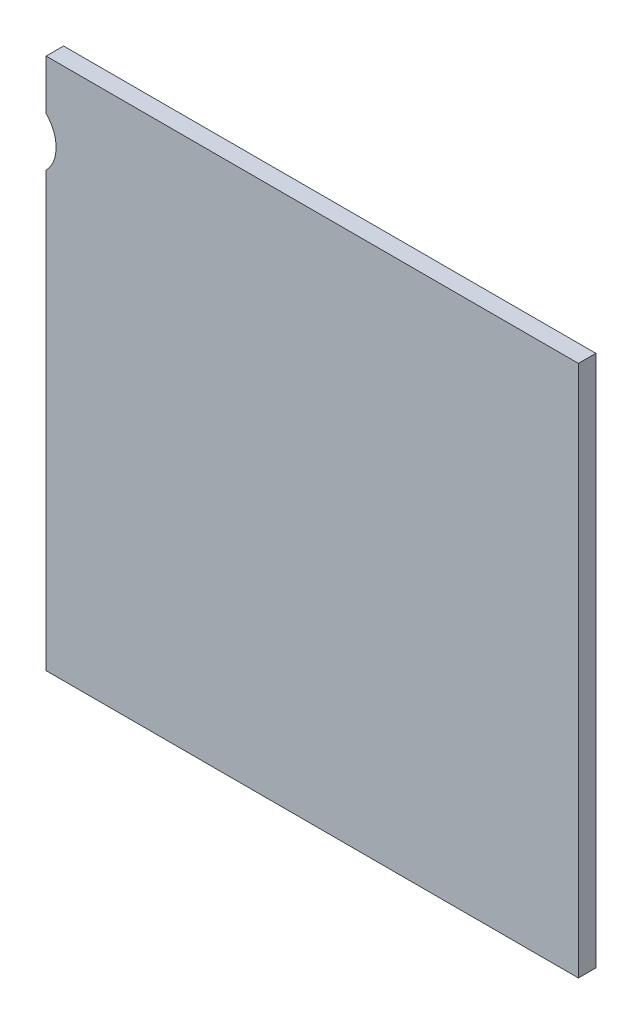
ISO-10303-21;
HEADER;
FILE_DESCRIPTION(('STEP AP214'),'2;1');
FILE_NAME('part.step','',(''),(''),'','','');
FILE_SCHEMA(('AUTOMOTIVE_DESIGN { 1 0 10303 214 1 1 1 1 }'));
ENDSEC;
DATA;
#1=APPLICATION_CONTEXT('core data for automotive mechanical design processes');
#2=APPLICATION_PROTOCOL_DEFINITION('international standard','automotive_design',2000,#1);
#3=PRODUCT_CONTEXT('',#1,'mechanical');
#4=PRODUCT('Part','Part','',(#3));
#5=PRODUCT_RELATED_PRODUCT_CATEGORY('part','',(#4));
#6=PRODUCT_DEFINITION_FORMATION('','',#4);
#7=PRODUCT_DEFINITION_CONTEXT('part definition',#1,'design');
#8=PRODUCT_DEFINITION('design','',#6,#7);
#9=PRODUCT_DEFINITION_SHAPE('','',#8);
#10=(LENGTH_UNIT() NAMED_UNIT(*) SI_UNIT(.MILLI.,.METRE.));
#11=(NAMED_UNIT(*) PLANE_ANGLE_UNIT() SI_UNIT($,.RADIAN.));
#12=(NAMED_UNIT(*) SI_UNIT($,.STERADIAN.) SOLID_ANGLE_UNIT());
#13=UNCERTAINTY_MEASURE_WITH_UNIT(LENGTH_MEASURE(1.E-05),#10,'distance_accuracy_value','');
#14=(GEOMETRIC_REPRESENTATION_CONTEXT(3) GLOBAL_UNCERTAINTY_ASSIGNED_CONTEXT((#13)) GLOBAL_UNIT_ASSIGNED_CONTEXT((#10,
#11,#12)) REPRESENTATION_CONTEXT('',''));
#15=CARTESIAN_POINT('',(0.,0.,0.));
#16=DIRECTION('',(0.,0.,1.));
#17=DIRECTION('',(1.,0.,0.));
#18=AXIS2_PLACEMENT_3D('',#15,#16,#17);
#19=CARTESIAN_POINT('',(-0.002492937849894,0.00240795734793,0.1));
#20=DIRECTION('',(0.,0.,1.));
#21=DIRECTION('',(1.,0.,0.));
#22=AXIS2_PLACEMENT_3D('',#19,#20,#21);
#23=PLANE('',#22);
#24=DIRECTION('',(0.,-1.,0.));
#25=VECTOR('',#24,1.);
#26=CARTESIAN_POINT('',(1.525,1.525,0.1));
#27=LINE('',#26,#25);
#28=CARTESIAN_POINT('',(1.525,1.525,0.1));
#29=VERTEX_POINT('',#28);
#30=CARTESIAN_POINT('',(1.525,-1.525,0.1));
#31=VERTEX_POINT('',#30);
#32=EDGE_CURVE('E105',#29,#31,#27,.T.);
#33=ORIENTED_EDGE('',*,*,#32,.F.);
#34=DIRECTION('',(1.,0.,0.));
#35=VECTOR('',#34,1.);
#36=CARTESIAN_POINT('',(-1.525,1.525,0.1));
#37=LINE('',#36,#35);
#38=CARTESIAN_POINT('',(-1.525,1.525,0.1));
#39=VERTEX_POINT('',#38);
#40=EDGE_CURVE('E20',#39,#29,#37,.T.);
#41=ORIENTED_EDGE('',*,*,#40,.F.);
#42=DIRECTION('',(0.,1.,0.));
#43=VECTOR('',#42,1.);
#44=CARTESIAN_POINT('',(-1.525,1.23978200003,0.1));
#45=LINE('',#44,#43);
#46=CARTESIAN_POINT('',(-1.525,1.23978200003,0.1));
#47=VERTEX_POINT('',#46);
#48=EDGE_CURVE('E132',#47,#39,#45,.T.);
#49=ORIENTED_EDGE('',*,*,#48,.F.);
#50=CARTESIAN_POINT('',(-1.667622999874,1.09978200003,0.1));
#51=DIRECTION('',(0.,0.,1.));
#52=DIRECTION('',(1.,0.,0.));
#53=AXIS2_PLACEMENT_3D('',#50,#51,#52);
#54=CIRCLE('',#53,0.199853246391);
#55=CARTESIAN_POINT('',(-1.525,0.95978200003,0.1));
#56=VERTEX_POINT('',#55);
#57=EDGE_CURVE('E142',#56,#47,#54,.T.);
#58=ORIENTED_EDGE('',*,*,#57,.F.);
#59=DIRECTION('',(0.,1.,0.));
#60=VECTOR('',#59,1.);
#61=CARTESIAN_POINT('',(-1.525,-1.525,0.1));
#62=LINE('',#61,#60);
#63=CARTESIAN_POINT('',(-1.525,-1.525,0.1));
#64=VERTEX_POINT('',#63);
#65=EDGE_CURVE('E113',#64,#56,#62,.T.);
#66=ORIENTED_EDGE('',*,*,#65,.F.);
#67=DIRECTION('',(-1.,0.,0.));
#68=VECTOR('',#67,1.);
#69=CARTESIAN_POINT('',(1.525,-1.525,0.1));
#70=LINE('',#69,#68);
#71=EDGE_CURVE('E101',#31,#64,#70,.T.);
#72=ORIENTED_EDGE('',*,*,#71,.F.);
#73=EDGE_LOOP('',(#33,#41,#49,#58,#66,#72));
#74=FACE_BOUND('',#73,.T.);
#75=ADVANCED_FACE('F17',(#74),#23,.T.);
#76=CARTESIAN_POINT('',(-0.002492937849894,0.00240795734793,0.));
#77=DIRECTION('',(0.,0.,1.));
#78=DIRECTION('',(1.,0.,0.));
#79=AXIS2_PLACEMENT_3D('',#76,#77,#78);
#80=PLANE('',#79);
#81=DIRECTION('',(0.,-1.,0.));
#82=VECTOR('',#81,1.);
#83=CARTESIAN_POINT('',(1.525,1.525,0.));
#84=LINE('',#83,#82);
#85=CARTESIAN_POINT('',(1.525,1.525,0.));
#86=VERTEX_POINT('',#85);
#87=CARTESIAN_POINT('',(1.525,-1.525,0.));
#88=VERTEX_POINT('',#87);
#89=EDGE_CURVE('E88',#86,#88,#84,.T.);
#90=ORIENTED_EDGE('',*,*,#89,.T.);
#91=DIRECTION('',(-1.,0.,0.));
#92=VECTOR('',#91,1.);
#93=CARTESIAN_POINT('',(1.525,-1.525,0.));
#94=LINE('',#93,#92);
#95=CARTESIAN_POINT('',(-1.525,-1.525,0.));
#96=VERTEX_POINT('',#95);
#97=EDGE_CURVE('E118',#88,#96,#94,.T.);
#98=ORIENTED_EDGE('',*,*,#97,.T.);
#99=DIRECTION('',(0.,1.,0.));
#100=VECTOR('',#99,1.);
#101=CARTESIAN_POINT('',(-1.525,-1.525,0.));
#102=LINE('',#101,#100);
#103=CARTESIAN_POINT('',(-1.525,0.95978200003,0.));
#104=VERTEX_POINT('',#103);
#105=EDGE_CURVE('E138',#96,#104,#102,.T.);
#106=ORIENTED_EDGE('',*,*,#105,.T.);
#107=CARTESIAN_POINT('',(-1.667622999874,1.09978200003,0.));
#108=DIRECTION('',(0.,0.,1.));
#109=DIRECTION('',(1.,0.,0.));
#110=AXIS2_PLACEMENT_3D('',#107,#108,#109);
#111=CIRCLE('',#110,0.199853246391);
#112=CARTESIAN_POINT('',(-1.525,1.23978200003,0.));
#113=VERTEX_POINT('',#112);
#114=EDGE_CURVE('E130',#104,#113,#111,.T.);
#115=ORIENTED_EDGE('',*,*,#114,.T.);
#116=DIRECTION('',(0.,1.,0.));
#117=VECTOR('',#116,1.);
#118=CARTESIAN_POINT('',(-1.525,1.23978200003,0.));
#119=LINE('',#118,#117);
#120=CARTESIAN_POINT('',(-1.525,1.525,0.));
#121=VERTEX_POINT('',#120);
#122=EDGE_CURVE('E91',#113,#121,#119,.T.);
#123=ORIENTED_EDGE('',*,*,#122,.T.);
#124=DIRECTION('',(1.,0.,0.));
#125=VECTOR('',#124,1.);
#126=CARTESIAN_POINT('',(-1.525,1.525,0.));
#127=LINE('',#126,#125);
#128=EDGE_CURVE('E11',#121,#86,#127,.T.);
#129=ORIENTED_EDGE('',*,*,#128,.T.);
#130=EDGE_LOOP('',(#90,#98,#106,#115,#123,#129));
#131=FACE_BOUND('',#130,.T.);
#132=ADVANCED_FACE('F86',(#131),#80,.F.);
#133=CARTESIAN_POINT('',(-1.525,1.525,0.));
#134=DIRECTION('',(0.,1.,0.));
#135=DIRECTION('',(1.,0.,0.));
#136=AXIS2_PLACEMENT_3D('',#133,#134,#135);
#137=PLANE('',#136);
#138=DIRECTION('',(0.,0.,1.));
#139=VECTOR('',#138,1.);
#140=CARTESIAN_POINT('',(-1.525,1.525,0.));
#141=LINE('',#140,#139);
#142=EDGE_CURVE('E143',#121,#39,#141,.T.);
#143=ORIENTED_EDGE('',*,*,#142,.T.);
#144=ORIENTED_EDGE('',*,*,#40,.T.);
#145=DIRECTION('',(0.,0.,1.));
#146=VECTOR('',#145,1.);
#147=CARTESIAN_POINT('',(1.525,1.525,0.));
#148=LINE('',#147,#146);
#149=EDGE_CURVE('E97',#86,#29,#148,.T.);
#150=ORIENTED_EDGE('',*,*,#149,.F.);
#151=ORIENTED_EDGE('',*,*,#128,.F.);
#152=EDGE_LOOP('',(#143,#144,#150,#151));
#153=FACE_BOUND('',#152,.T.);
#154=ADVANCED_FACE('F103',(#153),#137,.T.);
#155=CARTESIAN_POINT('',(-1.525,1.23978200003,0.));
#156=DIRECTION('',(-1.,0.,0.));
#157=DIRECTION('',(0.,0.,1.));
#158=AXIS2_PLACEMENT_3D('',#155,#156,#157);
#159=PLANE('',#158);
#160=DIRECTION('',(0.,0.,1.));
#161=VECTOR('',#160,1.);
#162=CARTESIAN_POINT('',(-1.525,1.23978200003,0.));
#163=LINE('',#162,#161);
#164=EDGE_CURVE('E133',#113,#47,#163,.T.);
#165=ORIENTED_EDGE('',*,*,#164,.T.);
#166=ORIENTED_EDGE('',*,*,#48,.T.);
#167=ORIENTED_EDGE('',*,*,#142,.F.);
#168=ORIENTED_EDGE('',*,*,#122,.F.);
#169=EDGE_LOOP('',(#165,#166,#167,#168));
#170=FACE_BOUND('',#169,.T.);
#171=ADVANCED_FACE('F156',(#170),#159,.T.);
#172=CARTESIAN_POINT('',(-1.667622999874,1.09978200003,0.));
#173=DIRECTION('',(0.,0.,-1.));
#174=DIRECTION('',(1.,0.,0.));
#175=AXIS2_PLACEMENT_3D('',#172,#173,#174);
#176=CYLINDRICAL_SURFACE('',#175,0.199853246391);
#177=DIRECTION('',(0.,0.,1.));
#178=VECTOR('',#177,1.);
#179=CARTESIAN_POINT('',(-1.525,0.95978200003,0.));
#180=LINE('',#179,#178);
#181=EDGE_CURVE('E117',#104,#56,#180,.T.);
#182=ORIENTED_EDGE('',*,*,#181,.T.);
#183=ORIENTED_EDGE('',*,*,#57,.T.);
#184=ORIENTED_EDGE('',*,*,#164,.F.);
#185=ORIENTED_EDGE('',*,*,#114,.F.);
#186=EDGE_LOOP('',(#182,#183,#184,#185));
#187=FACE_BOUND('',#186,.T.);
#188=ADVANCED_FACE('F160',(#187),#176,.F.);
#189=CARTESIAN_POINT('',(-1.525,-1.525,0.));
#190=DIRECTION('',(-1.,0.,0.));
#191=DIRECTION('',(0.,0.,1.));
#192=AXIS2_PLACEMENT_3D('',#189,#190,#191);
#193=PLANE('',#192);
#194=DIRECTION('',(0.,0.,1.));
#195=VECTOR('',#194,1.);
#196=CARTESIAN_POINT('',(-1.525,-1.525,0.));
#197=LINE('',#196,#195);
#198=EDGE_CURVE('E121',#96,#64,#197,.T.);
#199=ORIENTED_EDGE('',*,*,#198,.T.);
#200=ORIENTED_EDGE('',*,*,#65,.T.);
#201=ORIENTED_EDGE('',*,*,#181,.F.);
#202=ORIENTED_EDGE('',*,*,#105,.F.);
#203=EDGE_LOOP('',(#199,#200,#201,#202));
#204=FACE_BOUND('',#203,.T.);
#205=ADVANCED_FACE('F162',(#204),#193,.T.);
#206=CARTESIAN_POINT('',(1.525,-1.525,0.));
#207=DIRECTION('',(0.,-1.,0.));
#208=DIRECTION('',(0.,0.,-1.));
#209=AXIS2_PLACEMENT_3D('',#206,#207,#208);
#210=PLANE('',#209);
#211=DIRECTION('',(0.,0.,1.));
#212=VECTOR('',#211,1.);
#213=CARTESIAN_POINT('',(1.525,-1.525,0.));
#214=LINE('',#213,#212);
#215=EDGE_CURVE('E99',#88,#31,#214,.T.);
#216=ORIENTED_EDGE('',*,*,#215,.T.);
#217=ORIENTED_EDGE('',*,*,#71,.T.);
#218=ORIENTED_EDGE('',*,*,#198,.F.);
#219=ORIENTED_EDGE('',*,*,#97,.F.);
#220=EDGE_LOOP('',(#216,#217,#218,#219));
#221=FACE_BOUND('',#220,.T.);
#222=ADVANCED_FACE('F165',(#221),#210,.T.);
#223=CARTESIAN_POINT('',(1.525,1.525,0.));
#224=DIRECTION('',(1.,0.,0.));
#225=DIRECTION('',(0.,1.,0.));
#226=AXIS2_PLACEMENT_3D('',#223,#224,#225);
#227=PLANE('',#226);
#228=ORIENTED_EDGE('',*,*,#149,.T.);
#229=ORIENTED_EDGE('',*,*,#32,.T.);
#230=ORIENTED_EDGE('',*,*,#215,.F.);
#231=ORIENTED_EDGE('',*,*,#89,.F.);
#232=EDGE_LOOP('',(#228,#229,#230,#231));
#233=FACE_BOUND('',#232,.T.);
#234=ADVANCED_FACE('F95',(#233),#227,.T.);
#235=CLOSED_SHELL('',(#75,#132,#154,#171,#188,#205,#222,#234));
#236=MANIFOLD_SOLID_BREP('B1',#235);
#237=ADVANCED_BREP_SHAPE_REPRESENTATION('',(#18,#236),#14);
#238=SHAPE_DEFINITION_REPRESENTATION(#9,#237);
ENDSEC;
END-ISO-10303-21;
